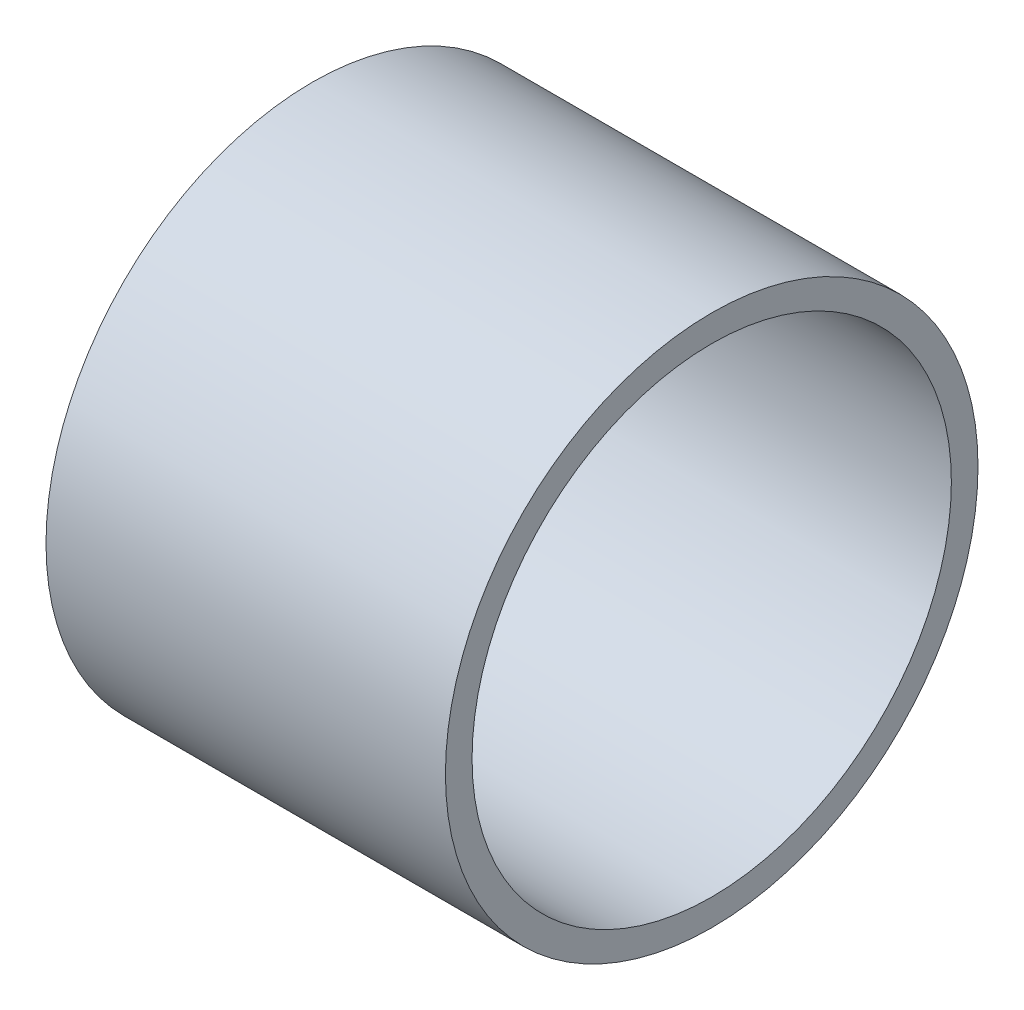
ISO-10303-21;
HEADER;
FILE_DESCRIPTION(('STEP AP214'),'2;1');
FILE_NAME('part.step','',(''),(''),'','','');
FILE_SCHEMA(('AUTOMOTIVE_DESIGN { 1 0 10303 214 1 1 1 1 }'));
ENDSEC;
DATA;
#1=APPLICATION_CONTEXT('core data for automotive mechanical design processes');
#2=APPLICATION_PROTOCOL_DEFINITION('international standard','automotive_design',2000,#1);
#3=PRODUCT_CONTEXT('',#1,'mechanical');
#4=PRODUCT('Part','Part','',(#3));
#5=PRODUCT_RELATED_PRODUCT_CATEGORY('part','',(#4));
#6=PRODUCT_DEFINITION_FORMATION('','',#4);
#7=PRODUCT_DEFINITION_CONTEXT('part definition',#1,'design');
#8=PRODUCT_DEFINITION('design','',#6,#7);
#9=PRODUCT_DEFINITION_SHAPE('','',#8);
#10=(LENGTH_UNIT() NAMED_UNIT(*) SI_UNIT(.MILLI.,.METRE.));
#11=(NAMED_UNIT(*) PLANE_ANGLE_UNIT() SI_UNIT($,.RADIAN.));
#12=(NAMED_UNIT(*) SI_UNIT($,.STERADIAN.) SOLID_ANGLE_UNIT());
#13=UNCERTAINTY_MEASURE_WITH_UNIT(LENGTH_MEASURE(1.E-05),#10,'distance_accuracy_value','');
#14=(GEOMETRIC_REPRESENTATION_CONTEXT(3) GLOBAL_UNCERTAINTY_ASSIGNED_CONTEXT((#13)) GLOBAL_UNIT_ASSIGNED_CONTEXT((#10,
#11,#12)) REPRESENTATION_CONTEXT('',''));
#15=CARTESIAN_POINT('',(0.,0.,0.));
#16=DIRECTION('',(0.,0.,1.));
#17=DIRECTION('',(1.,0.,0.));
#18=AXIS2_PLACEMENT_3D('',#15,#16,#17);
#19=CARTESIAN_POINT('',(60.,0.,0.));
#20=DIRECTION('',(-1.,0.,0.));
#21=DIRECTION('',(0.,0.,1.));
#22=AXIS2_PLACEMENT_3D('',#19,#20,#21);
#23=CYLINDRICAL_SURFACE('',#22,40.);
#24=CARTESIAN_POINT('',(60.,0.,0.));
#25=DIRECTION('',(-1.,0.,0.));
#26=DIRECTION('',(0.,0.,1.));
#27=AXIS2_PLACEMENT_3D('',#24,#25,#26);
#28=CIRCLE('',#27,40.);
#29=CARTESIAN_POINT('',(60.,0.,40.));
#30=VERTEX_POINT('',#29);
#31=EDGE_CURVE('E10',#30,#30,#28,.T.);
#32=ORIENTED_EDGE('',*,*,#31,.T.);
#33=EDGE_LOOP('',(#32));
#34=FACE_BOUND('',#33,.T.);
#35=CARTESIAN_POINT('',(0.,0.,0.));
#36=DIRECTION('',(-1.,0.,0.));
#37=DIRECTION('',(0.,0.,1.));
#38=AXIS2_PLACEMENT_3D('',#35,#36,#37);
#39=CIRCLE('',#38,40.);
#40=CARTESIAN_POINT('',(0.,0.,40.));
#41=VERTEX_POINT('',#40);
#42=EDGE_CURVE('E47',#41,#41,#39,.T.);
#43=ORIENTED_EDGE('',*,*,#42,.F.);
#44=EDGE_LOOP('',(#43));
#45=FACE_BOUND('',#44,.T.);
#46=ADVANCED_FACE('F33',(#34,#45),#23,.T.);
#47=CARTESIAN_POINT('',(60.,40.,0.));
#48=DIRECTION('',(1.,0.,0.));
#49=DIRECTION('',(0.,0.,-1.));
#50=AXIS2_PLACEMENT_3D('',#47,#48,#49);
#51=PLANE('',#50);
#52=CARTESIAN_POINT('',(60.,0.,0.));
#53=DIRECTION('',(-1.,0.,0.));
#54=DIRECTION('',(0.,0.,1.));
#55=AXIS2_PLACEMENT_3D('',#52,#53,#54);
#56=CIRCLE('',#55,36.);
#57=CARTESIAN_POINT('',(60.,0.,36.));
#58=VERTEX_POINT('',#57);
#59=EDGE_CURVE('E39',#58,#58,#56,.T.);
#60=ORIENTED_EDGE('',*,*,#59,.T.);
#61=EDGE_LOOP('',(#60));
#62=FACE_BOUND('',#61,.T.);
#63=ORIENTED_EDGE('',*,*,#31,.F.);
#64=EDGE_LOOP('',(#63));
#65=FACE_BOUND('',#64,.T.);
#66=ADVANCED_FACE('F57',(#62,#65),#51,.T.);
#67=CARTESIAN_POINT('',(60.,0.,0.));
#68=DIRECTION('',(-1.,0.,0.));
#69=DIRECTION('',(0.,0.,1.));
#70=AXIS2_PLACEMENT_3D('',#67,#68,#69);
#71=CYLINDRICAL_SURFACE('',#70,36.);
#72=CARTESIAN_POINT('',(0.,0.,0.));
#73=DIRECTION('',(-1.,0.,0.));
#74=DIRECTION('',(0.,0.,1.));
#75=AXIS2_PLACEMENT_3D('',#72,#73,#74);
#76=CIRCLE('',#75,36.);
#77=CARTESIAN_POINT('',(0.,0.,36.));
#78=VERTEX_POINT('',#77);
#79=EDGE_CURVE('E43',#78,#78,#76,.T.);
#80=ORIENTED_EDGE('',*,*,#79,.T.);
#81=EDGE_LOOP('',(#80));
#82=FACE_BOUND('',#81,.T.);
#83=ORIENTED_EDGE('',*,*,#59,.F.);
#84=EDGE_LOOP('',(#83));
#85=FACE_BOUND('',#84,.T.);
#86=ADVANCED_FACE('F61',(#82,#85),#71,.F.);
#87=CARTESIAN_POINT('',(0.,36.,0.));
#88=DIRECTION('',(-1.,0.,0.));
#89=DIRECTION('',(0.,0.,1.));
#90=AXIS2_PLACEMENT_3D('',#87,#88,#89);
#91=PLANE('',#90);
#92=ORIENTED_EDGE('',*,*,#42,.T.);
#93=EDGE_LOOP('',(#92));
#94=FACE_BOUND('',#93,.T.);
#95=ORIENTED_EDGE('',*,*,#79,.F.);
#96=EDGE_LOOP('',(#95));
#97=FACE_BOUND('',#96,.T.);
#98=ADVANCED_FACE('F53',(#94,#97),#91,.T.);
#99=CLOSED_SHELL('',(#46,#66,#86,#98));
#100=MANIFOLD_SOLID_BREP('B2',#99);
#101=ADVANCED_BREP_SHAPE_REPRESENTATION('',(#18,#100),#14);
#102=SHAPE_DEFINITION_REPRESENTATION(#9,#101);
ENDSEC;
END-ISO-10303-21;
